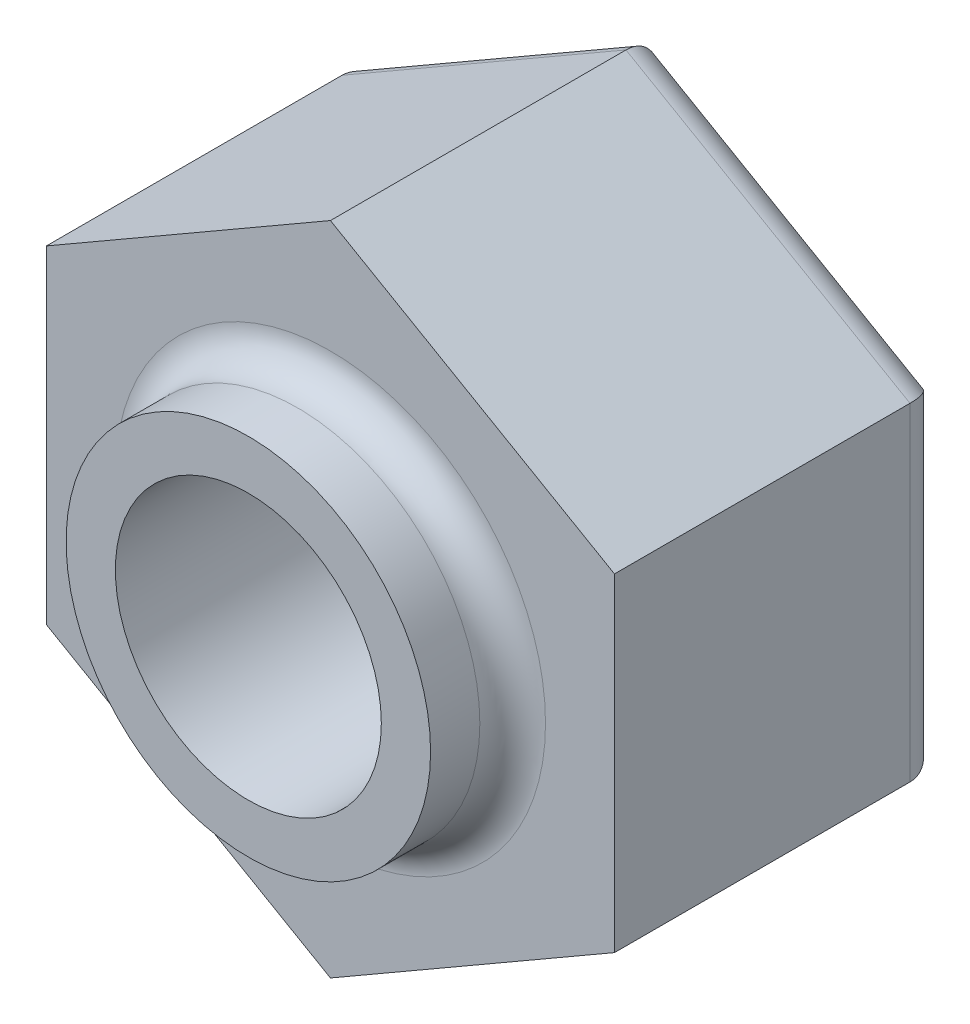
ISO-10303-21;
HEADER;
FILE_DESCRIPTION(('STEP AP214'),'2;1');
FILE_NAME('part.step','',(''),(''),'','','');
FILE_SCHEMA(('AUTOMOTIVE_DESIGN { 1 0 10303 214 1 1 1 1 }'));
ENDSEC;
DATA;
#1=APPLICATION_CONTEXT('core data for automotive mechanical design processes');
#2=APPLICATION_PROTOCOL_DEFINITION('international standard','automotive_design',2000,#1);
#3=PRODUCT_CONTEXT('',#1,'mechanical');
#4=PRODUCT('Part','Part','',(#3));
#5=PRODUCT_RELATED_PRODUCT_CATEGORY('part','',(#4));
#6=PRODUCT_DEFINITION_FORMATION('','',#4);
#7=PRODUCT_DEFINITION_CONTEXT('part definition',#1,'design');
#8=PRODUCT_DEFINITION('design','',#6,#7);
#9=PRODUCT_DEFINITION_SHAPE('','',#8);
#10=(LENGTH_UNIT() NAMED_UNIT(*) SI_UNIT(.MILLI.,.METRE.));
#11=(NAMED_UNIT(*) PLANE_ANGLE_UNIT() SI_UNIT($,.RADIAN.));
#12=(NAMED_UNIT(*) SI_UNIT($,.STERADIAN.) SOLID_ANGLE_UNIT());
#13=UNCERTAINTY_MEASURE_WITH_UNIT(LENGTH_MEASURE(1.E-05),#10,'distance_accuracy_value','');
#14=(GEOMETRIC_REPRESENTATION_CONTEXT(3) GLOBAL_UNCERTAINTY_ASSIGNED_CONTEXT((#13)) GLOBAL_UNIT_ASSIGNED_CONTEXT((#10,
#11,#12)) REPRESENTATION_CONTEXT('',''));
#15=CARTESIAN_POINT('',(0.,0.,0.));
#16=DIRECTION('',(0.,0.,1.));
#17=DIRECTION('',(1.,0.,0.));
#18=AXIS2_PLACEMENT_3D('',#15,#16,#17);
#19=CARTESIAN_POINT('',(0.,0.,10.));
#20=DIRECTION('',(0.,0.,1.));
#21=DIRECTION('',(1.,0.,0.));
#22=AXIS2_PLACEMENT_3D('',#19,#20,#21);
#23=PLANE('',#22);
#24=CARTESIAN_POINT('',(0.,0.,10.));
#25=DIRECTION('',(0.,0.,1.));
#26=DIRECTION('',(1.,0.,0.));
#27=AXIS2_PLACEMENT_3D('',#24,#25,#26);
#28=CIRCLE('',#27,6.55);
#29=CARTESIAN_POINT('',(6.55,0.,10.));
#30=VERTEX_POINT('',#29);
#31=EDGE_CURVE('E11',#30,#30,#28,.F.);
#32=ORIENTED_EDGE('',*,*,#31,.T.);
#33=EDGE_LOOP('',(#32));
#34=FACE_BOUND('',#33,.T.);
#35=DIRECTION('',(0.866025403784439,0.5,0.));
#36=VECTOR('',#35,1.);
#37=CARTESIAN_POINT('',(0.,-9.98815965698053,10.));
#38=LINE('',#37,#36);
#39=CARTESIAN_POINT('',(0.,-9.98815965698053,10.));
#40=VERTEX_POINT('',#39);
#41=CARTESIAN_POINT('',(8.65,-4.99407982849027,10.));
#42=VERTEX_POINT('',#41);
#43=EDGE_CURVE('E127',#40,#42,#38,.T.);
#44=ORIENTED_EDGE('',*,*,#43,.T.);
#45=DIRECTION('',(0.,1.,0.));
#46=VECTOR('',#45,1.);
#47=CARTESIAN_POINT('',(8.65,-4.99407982849027,10.));
#48=LINE('',#47,#46);
#49=CARTESIAN_POINT('',(8.65,4.99407982849027,10.));
#50=VERTEX_POINT('',#49);
#51=EDGE_CURVE('E115',#42,#50,#48,.T.);
#52=ORIENTED_EDGE('',*,*,#51,.T.);
#53=DIRECTION('',(-0.866025403784439,0.5,0.));
#54=VECTOR('',#53,1.);
#55=CARTESIAN_POINT('',(8.65,4.99407982849027,10.));
#56=LINE('',#55,#54);
#57=CARTESIAN_POINT('',(0.,9.98815965698053,10.));
#58=VERTEX_POINT('',#57);
#59=EDGE_CURVE('E126',#50,#58,#56,.T.);
#60=ORIENTED_EDGE('',*,*,#59,.T.);
#61=DIRECTION('',(-0.866025403784439,-0.5,0.));
#62=VECTOR('',#61,1.);
#63=CARTESIAN_POINT('',(0.,9.98815965698053,10.));
#64=LINE('',#63,#62);
#65=CARTESIAN_POINT('',(-8.65,4.99407982849027,10.));
#66=VERTEX_POINT('',#65);
#67=EDGE_CURVE('E201',#58,#66,#64,.T.);
#68=ORIENTED_EDGE('',*,*,#67,.T.);
#69=DIRECTION('',(0.,-1.,0.));
#70=VECTOR('',#69,1.);
#71=CARTESIAN_POINT('',(-8.65,4.99407982849027,10.));
#72=LINE('',#71,#70);
#73=CARTESIAN_POINT('',(-8.65,-4.99407982849026,10.));
#74=VERTEX_POINT('',#73);
#75=EDGE_CURVE('E203',#66,#74,#72,.T.);
#76=ORIENTED_EDGE('',*,*,#75,.T.);
#77=DIRECTION('',(0.866025403784439,-0.5,0.));
#78=VECTOR('',#77,1.);
#79=CARTESIAN_POINT('',(-8.65,-4.99407982849026,10.));
#80=LINE('',#79,#78);
#81=EDGE_CURVE('E131',#74,#40,#80,.T.);
#82=ORIENTED_EDGE('',*,*,#81,.T.);
#83=EDGE_LOOP('',(#44,#52,#60,#68,#76,#82));
#84=FACE_BOUND('',#83,.T.);
#85=ADVANCED_FACE('F39',(#34,#84),#23,.T.);
#86=CARTESIAN_POINT('',(0.,0.,0.));
#87=DIRECTION('',(0.,0.,1.));
#88=DIRECTION('',(1.,0.,0.));
#89=AXIS2_PLACEMENT_3D('',#86,#87,#88);
#90=PLANE('',#89);
#91=CARTESIAN_POINT('',(0.,0.,0.));
#92=DIRECTION('',(0.,0.,1.));
#93=DIRECTION('',(1.,0.,0.));
#94=AXIS2_PLACEMENT_3D('',#91,#92,#93);
#95=CIRCLE('',#94,5.05);
#96=CARTESIAN_POINT('',(5.05,0.,0.));
#97=VERTEX_POINT('',#96);
#98=EDGE_CURVE('E156',#97,#97,#95,.T.);
#99=ORIENTED_EDGE('',*,*,#98,.T.);
#100=EDGE_LOOP('',(#99));
#101=FACE_BOUND('',#100,.T.);
#102=DIRECTION('',(-0.866025403784439,0.5,0.));
#103=VECTOR('',#102,1.);
#104=CARTESIAN_POINT('',(3.825,6.62509433895096,0.));
#105=LINE('',#104,#103);
#106=CARTESIAN_POINT('',(0.,8.83345911860128,0.));
#107=VERTEX_POINT('',#106);
#108=CARTESIAN_POINT('',(7.65,4.41672955930064,0.));
#109=VERTEX_POINT('',#108);
#110=EDGE_CURVE('E151',#107,#109,#105,.F.);
#111=ORIENTED_EDGE('',*,*,#110,.T.);
#112=DIRECTION('',(0.,1.,0.));
#113=VECTOR('',#112,1.);
#114=CARTESIAN_POINT('',(7.65,0.,0.));
#115=LINE('',#114,#113);
#116=CARTESIAN_POINT('',(7.65,-4.41672955930064,0.));
#117=VERTEX_POINT('',#116);
#118=EDGE_CURVE('E153',#109,#117,#115,.F.);
#119=ORIENTED_EDGE('',*,*,#118,.T.);
#120=DIRECTION('',(0.866025403784439,0.5,0.));
#121=VECTOR('',#120,1.);
#122=CARTESIAN_POINT('',(3.825,-6.62509433895096,0.));
#123=LINE('',#122,#121);
#124=CARTESIAN_POINT('',(0.,-8.83345911860128,0.));
#125=VERTEX_POINT('',#124);
#126=EDGE_CURVE('E138',#117,#125,#123,.F.);
#127=ORIENTED_EDGE('',*,*,#126,.T.);
#128=DIRECTION('',(0.866025403784439,-0.5,0.));
#129=VECTOR('',#128,1.);
#130=CARTESIAN_POINT('',(-3.825,-6.62509433895096,0.));
#131=LINE('',#130,#129);
#132=CARTESIAN_POINT('',(-7.65,-4.41672955930064,0.));
#133=VERTEX_POINT('',#132);
#134=EDGE_CURVE('E140',#125,#133,#131,.F.);
#135=ORIENTED_EDGE('',*,*,#134,.T.);
#136=DIRECTION('',(0.,-1.,0.));
#137=VECTOR('',#136,1.);
#138=CARTESIAN_POINT('',(-7.65,0.,0.));
#139=LINE('',#138,#137);
#140=CARTESIAN_POINT('',(-7.65,4.41672955930064,0.));
#141=VERTEX_POINT('',#140);
#142=EDGE_CURVE('E147',#133,#141,#139,.F.);
#143=ORIENTED_EDGE('',*,*,#142,.T.);
#144=DIRECTION('',(-0.866025403784439,-0.5,0.));
#145=VECTOR('',#144,1.);
#146=CARTESIAN_POINT('',(-3.825,6.62509433895096,0.));
#147=LINE('',#146,#145);
#148=EDGE_CURVE('E149',#141,#107,#147,.F.);
#149=ORIENTED_EDGE('',*,*,#148,.T.);
#150=EDGE_LOOP('',(#111,#119,#127,#135,#143,#149));
#151=FACE_BOUND('',#150,.T.);
#152=ADVANCED_FACE('F227',(#101,#151),#90,.F.);
#153=CARTESIAN_POINT('',(0.,-9.98815965698053,10.));
#154=DIRECTION('',(-0.5,0.866025403784439,0.));
#155=DIRECTION('',(-0.866025403784439,-0.5,0.));
#156=AXIS2_PLACEMENT_3D('',#153,#154,#155);
#157=PLANE('',#156);
#158=DIRECTION('',(0.,0.,-1.));
#159=VECTOR('',#158,1.);
#160=CARTESIAN_POINT('',(0.,-9.98815965698053,10.));
#161=LINE('',#160,#159);
#162=CARTESIAN_POINT('',(0.,-9.98815965698053,0.999999999999999));
#163=VERTEX_POINT('',#162);
#164=EDGE_CURVE('E206',#40,#163,#161,.T.);
#165=ORIENTED_EDGE('',*,*,#164,.T.);
#166=DIRECTION('',(0.866025403784439,0.5,0.));
#167=VECTOR('',#166,1.);
#168=CARTESIAN_POINT('',(0.,-9.98815965698053,0.999999999999999));
#169=LINE('',#168,#167);
#170=CARTESIAN_POINT('',(8.65,-4.99407982849027,0.999999999999999));
#171=VERTEX_POINT('',#170);
#172=EDGE_CURVE('E137',#163,#171,#169,.T.);
#173=ORIENTED_EDGE('',*,*,#172,.T.);
#174=DIRECTION('',(0.,0.,-1.));
#175=VECTOR('',#174,1.);
#176=CARTESIAN_POINT('',(8.65,-4.99407982849027,10.));
#177=LINE('',#176,#175);
#178=EDGE_CURVE('E120',#42,#171,#177,.T.);
#179=ORIENTED_EDGE('',*,*,#178,.F.);
#180=ORIENTED_EDGE('',*,*,#43,.F.);
#181=EDGE_LOOP('',(#165,#173,#179,#180));
#182=FACE_BOUND('',#181,.T.);
#183=ADVANCED_FACE('F135',(#182),#157,.F.);
#184=CARTESIAN_POINT('',(8.65,-4.99407982849027,10.));
#185=DIRECTION('',(-1.,0.,0.));
#186=DIRECTION('',(0.,0.,1.));
#187=AXIS2_PLACEMENT_3D('',#184,#185,#186);
#188=PLANE('',#187);
#189=ORIENTED_EDGE('',*,*,#178,.T.);
#190=DIRECTION('',(0.,1.,0.));
#191=VECTOR('',#190,1.);
#192=CARTESIAN_POINT('',(8.65,-4.99407982849027,0.999999999999999));
#193=LINE('',#192,#191);
#194=CARTESIAN_POINT('',(8.65,4.99407982849027,0.999999999999999));
#195=VERTEX_POINT('',#194);
#196=EDGE_CURVE('E162',#171,#195,#193,.T.);
#197=ORIENTED_EDGE('',*,*,#196,.T.);
#198=DIRECTION('',(0.,0.,-1.));
#199=VECTOR('',#198,1.);
#200=CARTESIAN_POINT('',(8.65,4.99407982849027,10.));
#201=LINE('',#200,#199);
#202=EDGE_CURVE('E123',#50,#195,#201,.T.);
#203=ORIENTED_EDGE('',*,*,#202,.F.);
#204=ORIENTED_EDGE('',*,*,#51,.F.);
#205=EDGE_LOOP('',(#189,#197,#203,#204));
#206=FACE_BOUND('',#205,.T.);
#207=ADVANCED_FACE('F117',(#206),#188,.F.);
#208=CARTESIAN_POINT('',(8.65,4.99407982849027,10.));
#209=DIRECTION('',(-0.5,-0.866025403784439,0.));
#210=DIRECTION('',(0.866025403784439,-0.5,0.));
#211=AXIS2_PLACEMENT_3D('',#208,#209,#210);
#212=PLANE('',#211);
#213=ORIENTED_EDGE('',*,*,#202,.T.);
#214=DIRECTION('',(-0.866025403784439,0.5,0.));
#215=VECTOR('',#214,1.);
#216=CARTESIAN_POINT('',(8.65,4.99407982849027,0.999999999999999));
#217=LINE('',#216,#215);
#218=CARTESIAN_POINT('',(0.,9.98815965698053,0.999999999999999));
#219=VERTEX_POINT('',#218);
#220=EDGE_CURVE('E164',#195,#219,#217,.T.);
#221=ORIENTED_EDGE('',*,*,#220,.T.);
#222=DIRECTION('',(0.,0.,-1.));
#223=VECTOR('',#222,1.);
#224=CARTESIAN_POINT('',(0.,9.98815965698053,10.));
#225=LINE('',#224,#223);
#226=EDGE_CURVE('E142',#58,#219,#225,.T.);
#227=ORIENTED_EDGE('',*,*,#226,.F.);
#228=ORIENTED_EDGE('',*,*,#59,.F.);
#229=EDGE_LOOP('',(#213,#221,#227,#228));
#230=FACE_BOUND('',#229,.T.);
#231=ADVANCED_FACE('F267',(#230),#212,.F.);
#232=CARTESIAN_POINT('',(0.,9.98815965698053,10.));
#233=DIRECTION('',(0.5,-0.866025403784439,0.));
#234=DIRECTION('',(0.866025403784439,0.5,0.));
#235=AXIS2_PLACEMENT_3D('',#232,#233,#234);
#236=PLANE('',#235);
#237=ORIENTED_EDGE('',*,*,#226,.T.);
#238=DIRECTION('',(-0.866025403784439,-0.5,0.));
#239=VECTOR('',#238,1.);
#240=CARTESIAN_POINT('',(0.,9.98815965698053,0.999999999999999));
#241=LINE('',#240,#239);
#242=CARTESIAN_POINT('',(-8.65,4.99407982849027,0.999999999999999));
#243=VERTEX_POINT('',#242);
#244=EDGE_CURVE('E166',#219,#243,#241,.T.);
#245=ORIENTED_EDGE('',*,*,#244,.T.);
#246=DIRECTION('',(0.,0.,-1.));
#247=VECTOR('',#246,1.);
#248=CARTESIAN_POINT('',(-8.65,4.99407982849027,10.));
#249=LINE('',#248,#247);
#250=EDGE_CURVE('E210',#66,#243,#249,.T.);
#251=ORIENTED_EDGE('',*,*,#250,.F.);
#252=ORIENTED_EDGE('',*,*,#67,.F.);
#253=EDGE_LOOP('',(#237,#245,#251,#252));
#254=FACE_BOUND('',#253,.T.);
#255=ADVANCED_FACE('F215',(#254),#236,.F.);
#256=CARTESIAN_POINT('',(-8.65,4.99407982849027,10.));
#257=DIRECTION('',(1.,0.,0.));
#258=DIRECTION('',(0.,0.,-1.));
#259=AXIS2_PLACEMENT_3D('',#256,#257,#258);
#260=PLANE('',#259);
#261=ORIENTED_EDGE('',*,*,#250,.T.);
#262=DIRECTION('',(0.,-1.,0.));
#263=VECTOR('',#262,1.);
#264=CARTESIAN_POINT('',(-8.65,4.99407982849027,0.999999999999999));
#265=LINE('',#264,#263);
#266=CARTESIAN_POINT('',(-8.65,-4.99407982849026,0.999999999999999));
#267=VERTEX_POINT('',#266);
#268=EDGE_CURVE('E64',#243,#267,#265,.T.);
#269=ORIENTED_EDGE('',*,*,#268,.T.);
#270=DIRECTION('',(0.,0.,-1.));
#271=VECTOR('',#270,1.);
#272=CARTESIAN_POINT('',(-8.65,-4.99407982849026,10.));
#273=LINE('',#272,#271);
#274=EDGE_CURVE('E208',#74,#267,#273,.T.);
#275=ORIENTED_EDGE('',*,*,#274,.F.);
#276=ORIENTED_EDGE('',*,*,#75,.F.);
#277=EDGE_LOOP('',(#261,#269,#275,#276));
#278=FACE_BOUND('',#277,.T.);
#279=ADVANCED_FACE('F262',(#278),#260,.F.);
#280=CARTESIAN_POINT('',(-8.65,-4.99407982849026,10.));
#281=DIRECTION('',(0.5,0.866025403784439,0.));
#282=DIRECTION('',(-0.866025403784439,0.5,0.));
#283=AXIS2_PLACEMENT_3D('',#280,#281,#282);
#284=PLANE('',#283);
#285=ORIENTED_EDGE('',*,*,#274,.T.);
#286=DIRECTION('',(0.866025403784439,-0.5,0.));
#287=VECTOR('',#286,1.);
#288=CARTESIAN_POINT('',(-8.65,-4.99407982849026,0.999999999999999));
#289=LINE('',#288,#287);
#290=EDGE_CURVE('E56',#267,#163,#289,.T.);
#291=ORIENTED_EDGE('',*,*,#290,.T.);
#292=ORIENTED_EDGE('',*,*,#164,.F.);
#293=ORIENTED_EDGE('',*,*,#81,.F.);
#294=EDGE_LOOP('',(#285,#291,#292,#293));
#295=FACE_BOUND('',#294,.T.);
#296=ADVANCED_FACE('F259',(#295),#284,.F.);
#297=CARTESIAN_POINT('',(0.,0.,10.));
#298=DIRECTION('',(0.,0.,-1.));
#299=DIRECTION('',(-1.,0.,0.));
#300=AXIS2_PLACEMENT_3D('',#297,#298,#299);
#301=CYLINDRICAL_SURFACE('',#300,4.05);
#302=CARTESIAN_POINT('',(0.,0.,0.999999999999999));
#303=DIRECTION('',(0.,0.,1.));
#304=DIRECTION('',(1.,0.,0.));
#305=AXIS2_PLACEMENT_3D('',#302,#303,#304);
#306=CIRCLE('',#305,4.05);
#307=CARTESIAN_POINT('',(4.05,0.,0.999999999999999));
#308=VERTEX_POINT('',#307);
#309=EDGE_CURVE('E159',#308,#308,#306,.F.);
#310=ORIENTED_EDGE('',*,*,#309,.T.);
#311=EDGE_LOOP('',(#310));
#312=FACE_BOUND('',#311,.T.);
#313=CARTESIAN_POINT('',(0.,0.,12.5));
#314=DIRECTION('',(0.,0.,1.));
#315=DIRECTION('',(1.,0.,0.));
#316=AXIS2_PLACEMENT_3D('',#313,#314,#315);
#317=CIRCLE('',#316,4.05);
#318=CARTESIAN_POINT('',(4.05,0.,12.5));
#319=VERTEX_POINT('',#318);
#320=EDGE_CURVE('E189',#319,#319,#317,.F.);
#321=ORIENTED_EDGE('',*,*,#320,.F.);
#322=EDGE_LOOP('',(#321));
#323=FACE_BOUND('',#322,.T.);
#324=ADVANCED_FACE('F256',(#312,#323),#301,.F.);
#325=CARTESIAN_POINT('',(0.,0.,12.5));
#326=DIRECTION('',(0.,0.,-1.));
#327=DIRECTION('',(-1.,0.,0.));
#328=AXIS2_PLACEMENT_3D('',#325,#326,#327);
#329=CYLINDRICAL_SURFACE('',#328,5.55);
#330=CARTESIAN_POINT('',(0.,0.,11.));
#331=DIRECTION('',(0.,0.,1.));
#332=DIRECTION('',(1.,0.,0.));
#333=AXIS2_PLACEMENT_3D('',#330,#331,#332);
#334=CIRCLE('',#333,5.55);
#335=CARTESIAN_POINT('',(5.55,0.,11.));
#336=VERTEX_POINT('',#335);
#337=EDGE_CURVE('E48',#336,#336,#334,.T.);
#338=ORIENTED_EDGE('',*,*,#337,.T.);
#339=EDGE_LOOP('',(#338));
#340=FACE_BOUND('',#339,.T.);
#341=CARTESIAN_POINT('',(0.,0.,12.5));
#342=DIRECTION('',(0.,0.,1.));
#343=DIRECTION('',(1.,0.,0.));
#344=AXIS2_PLACEMENT_3D('',#341,#342,#343);
#345=CIRCLE('',#344,5.55);
#346=CARTESIAN_POINT('',(5.55,0.,12.5));
#347=VERTEX_POINT('',#346);
#348=EDGE_CURVE('E133',#347,#347,#345,.T.);
#349=ORIENTED_EDGE('',*,*,#348,.F.);
#350=EDGE_LOOP('',(#349));
#351=FACE_BOUND('',#350,.T.);
#352=ADVANCED_FACE('F353',(#340,#351),#329,.T.);
#353=CARTESIAN_POINT('',(0.,0.,12.5));
#354=DIRECTION('',(0.,0.,1.));
#355=DIRECTION('',(1.,0.,0.));
#356=AXIS2_PLACEMENT_3D('',#353,#354,#355);
#357=PLANE('',#356);
#358=ORIENTED_EDGE('',*,*,#320,.T.);
#359=EDGE_LOOP('',(#358));
#360=FACE_BOUND('',#359,.T.);
#361=ORIENTED_EDGE('',*,*,#348,.T.);
#362=EDGE_LOOP('',(#361));
#363=FACE_BOUND('',#362,.T.);
#364=ADVANCED_FACE('F276',(#360,#363),#357,.T.);
#365=CARTESIAN_POINT('',(0.,0.,0.999999999999999));
#366=DIRECTION('',(0.,0.,1.));
#367=DIRECTION('',(1.,0.,0.));
#368=AXIS2_PLACEMENT_3D('',#365,#366,#367);
#369=TOROIDAL_SURFACE('',#368,5.05,1.);
#370=ORIENTED_EDGE('',*,*,#309,.F.);
#371=EDGE_LOOP('',(#370));
#372=FACE_BOUND('',#371,.T.);
#373=ORIENTED_EDGE('',*,*,#98,.F.);
#374=EDGE_LOOP('',(#373));
#375=FACE_BOUND('',#374,.T.);
#376=ADVANCED_FACE('F245',(#372,#375),#369,.T.);
#377=CARTESIAN_POINT('',(-7.65,4.99407982849027,0.999999999999999));
#378=DIRECTION('',(0.,-1.,0.));
#379=DIRECTION('',(0.,0.,-1.));
#380=AXIS2_PLACEMENT_3D('',#377,#378,#379);
#381=CYLINDRICAL_SURFACE('',#380,1.);
#382=CARTESIAN_POINT('',(-7.65,4.41672955930064,0.999999999999999));
#383=DIRECTION('',(-0.5,-0.866025403784439,0.));
#384=DIRECTION('',(0.866025403784439,-0.5,0.));
#385=AXIS2_PLACEMENT_3D('',#382,#383,#384);
#386=ELLIPSE('',#385,1.15470053837925,1.);
#387=EDGE_CURVE('E182',#141,#243,#386,.F.);
#388=ORIENTED_EDGE('',*,*,#387,.F.);
#389=ORIENTED_EDGE('',*,*,#142,.F.);
#390=CARTESIAN_POINT('',(-7.65,-4.41672955930064,0.999999999999999));
#391=DIRECTION('',(0.5,-0.866025403784439,0.));
#392=DIRECTION('',(0.866025403784439,0.5,0.));
#393=AXIS2_PLACEMENT_3D('',#390,#391,#392);
#394=ELLIPSE('',#393,1.15470053837925,1.);
#395=EDGE_CURVE('E43',#267,#133,#394,.T.);
#396=ORIENTED_EDGE('',*,*,#395,.F.);
#397=ORIENTED_EDGE('',*,*,#268,.F.);
#398=EDGE_LOOP('',(#388,#389,#396,#397));
#399=FACE_BOUND('',#398,.T.);
#400=ADVANCED_FACE('F238',(#399),#381,.T.);
#401=CARTESIAN_POINT('',(-8.15,-4.12805442470583,0.999999999999999));
#402=DIRECTION('',(0.866025403784439,-0.5,0.));
#403=DIRECTION('',(0.5,0.866025403784439,0.));
#404=AXIS2_PLACEMENT_3D('',#401,#402,#403);
#405=CYLINDRICAL_SURFACE('',#404,1.);
#406=ORIENTED_EDGE('',*,*,#395,.T.);
#407=ORIENTED_EDGE('',*,*,#134,.F.);
#408=CARTESIAN_POINT('',(0.,-8.83345911860128,0.999999999999999));
#409=DIRECTION('',(1.,0.,0.));
#410=DIRECTION('',(0.,1.,0.));
#411=AXIS2_PLACEMENT_3D('',#408,#409,#410);
#412=ELLIPSE('',#411,1.15470053837925,1.);
#413=EDGE_CURVE('E180',#163,#125,#412,.T.);
#414=ORIENTED_EDGE('',*,*,#413,.F.);
#415=ORIENTED_EDGE('',*,*,#290,.F.);
#416=EDGE_LOOP('',(#406,#407,#414,#415));
#417=FACE_BOUND('',#416,.T.);
#418=ADVANCED_FACE('F236',(#417),#405,.T.);
#419=CARTESIAN_POINT('',(0.5,9.12213425319609,0.999999999999999));
#420=DIRECTION('',(-0.866025403784439,-0.5,0.));
#421=DIRECTION('',(0.5,-0.866025403784439,0.));
#422=AXIS2_PLACEMENT_3D('',#419,#420,#421);
#423=CYLINDRICAL_SURFACE('',#422,1.);
#424=ORIENTED_EDGE('',*,*,#387,.T.);
#425=ORIENTED_EDGE('',*,*,#244,.F.);
#426=CARTESIAN_POINT('',(0.,8.83345911860128,0.999999999999999));
#427=DIRECTION('',(-1.,0.,0.));
#428=DIRECTION('',(0.,-1.,0.));
#429=AXIS2_PLACEMENT_3D('',#426,#427,#428);
#430=ELLIPSE('',#429,1.15470053837925,1.);
#431=EDGE_CURVE('E177',#107,#219,#430,.F.);
#432=ORIENTED_EDGE('',*,*,#431,.F.);
#433=ORIENTED_EDGE('',*,*,#148,.F.);
#434=EDGE_LOOP('',(#424,#425,#432,#433));
#435=FACE_BOUND('',#434,.T.);
#436=ADVANCED_FACE('F219',(#435),#423,.T.);
#437=CARTESIAN_POINT('',(-0.500000000000001,-9.12213425319609,0.999999999999999));
#438=DIRECTION('',(0.866025403784439,0.5,0.));
#439=DIRECTION('',(-0.5,0.866025403784439,0.));
#440=AXIS2_PLACEMENT_3D('',#437,#438,#439);
#441=CYLINDRICAL_SURFACE('',#440,1.);
#442=ORIENTED_EDGE('',*,*,#413,.T.);
#443=ORIENTED_EDGE('',*,*,#126,.F.);
#444=CARTESIAN_POINT('',(7.65,-4.41672955930064,0.999999999999999));
#445=DIRECTION('',(0.5,0.866025403784439,0.));
#446=DIRECTION('',(0.866025403784439,-0.5,0.));
#447=AXIS2_PLACEMENT_3D('',#444,#445,#446);
#448=ELLIPSE('',#447,1.15470053837925,1.);
#449=EDGE_CURVE('E175',#171,#117,#448,.T.);
#450=ORIENTED_EDGE('',*,*,#449,.F.);
#451=ORIENTED_EDGE('',*,*,#172,.F.);
#452=EDGE_LOOP('',(#442,#443,#450,#451));
#453=FACE_BOUND('',#452,.T.);
#454=ADVANCED_FACE('F233',(#453),#441,.T.);
#455=CARTESIAN_POINT('',(8.15,4.12805442470583,0.999999999999999));
#456=DIRECTION('',(-0.866025403784439,0.5,0.));
#457=DIRECTION('',(-0.5,-0.866025403784439,0.));
#458=AXIS2_PLACEMENT_3D('',#455,#456,#457);
#459=CYLINDRICAL_SURFACE('',#458,1.);
#460=ORIENTED_EDGE('',*,*,#431,.T.);
#461=ORIENTED_EDGE('',*,*,#220,.F.);
#462=CARTESIAN_POINT('',(7.65,4.41672955930064,0.999999999999999));
#463=DIRECTION('',(-0.5,0.866025403784439,0.));
#464=DIRECTION('',(-0.866025403784439,-0.5,0.));
#465=AXIS2_PLACEMENT_3D('',#462,#463,#464);
#466=ELLIPSE('',#465,1.15470053837925,1.);
#467=EDGE_CURVE('E173',#109,#195,#466,.F.);
#468=ORIENTED_EDGE('',*,*,#467,.F.);
#469=ORIENTED_EDGE('',*,*,#110,.F.);
#470=EDGE_LOOP('',(#460,#461,#468,#469));
#471=FACE_BOUND('',#470,.T.);
#472=ADVANCED_FACE('F223',(#471),#459,.T.);
#473=CARTESIAN_POINT('',(7.65,-4.99407982849027,0.999999999999999));
#474=DIRECTION('',(0.,1.,0.));
#475=DIRECTION('',(0.,0.,1.));
#476=AXIS2_PLACEMENT_3D('',#473,#474,#475);
#477=CYLINDRICAL_SURFACE('',#476,1.);
#478=ORIENTED_EDGE('',*,*,#449,.T.);
#479=ORIENTED_EDGE('',*,*,#118,.F.);
#480=ORIENTED_EDGE('',*,*,#467,.T.);
#481=ORIENTED_EDGE('',*,*,#196,.F.);
#482=EDGE_LOOP('',(#478,#479,#480,#481));
#483=FACE_BOUND('',#482,.T.);
#484=ADVANCED_FACE('F229',(#483),#477,.T.);
#485=CARTESIAN_POINT('',(0.,0.,11.));
#486=DIRECTION('',(0.,0.,1.));
#487=DIRECTION('',(1.,0.,0.));
#488=AXIS2_PLACEMENT_3D('',#485,#486,#487);
#489=TOROIDAL_SURFACE('',#488,6.55,1.);
#490=ORIENTED_EDGE('',*,*,#31,.F.);
#491=EDGE_LOOP('',(#490));
#492=FACE_BOUND('',#491,.T.);
#493=ORIENTED_EDGE('',*,*,#337,.F.);
#494=EDGE_LOOP('',(#493));
#495=FACE_BOUND('',#494,.T.);
#496=ADVANCED_FACE('F41',(#492,#495),#489,.F.);
#497=CLOSED_SHELL('',(#85,#152,#183,#207,#231,#255,#279,#296,#324,#352,#364,#376,#400,#418,#436,
#454,#472,#484,#496));
#498=MANIFOLD_SOLID_BREP('B2',#497);
#499=ADVANCED_BREP_SHAPE_REPRESENTATION('',(#18,#498),#14);
#500=SHAPE_DEFINITION_REPRESENTATION(#9,#499);
ENDSEC;
END-ISO-10303-21;
